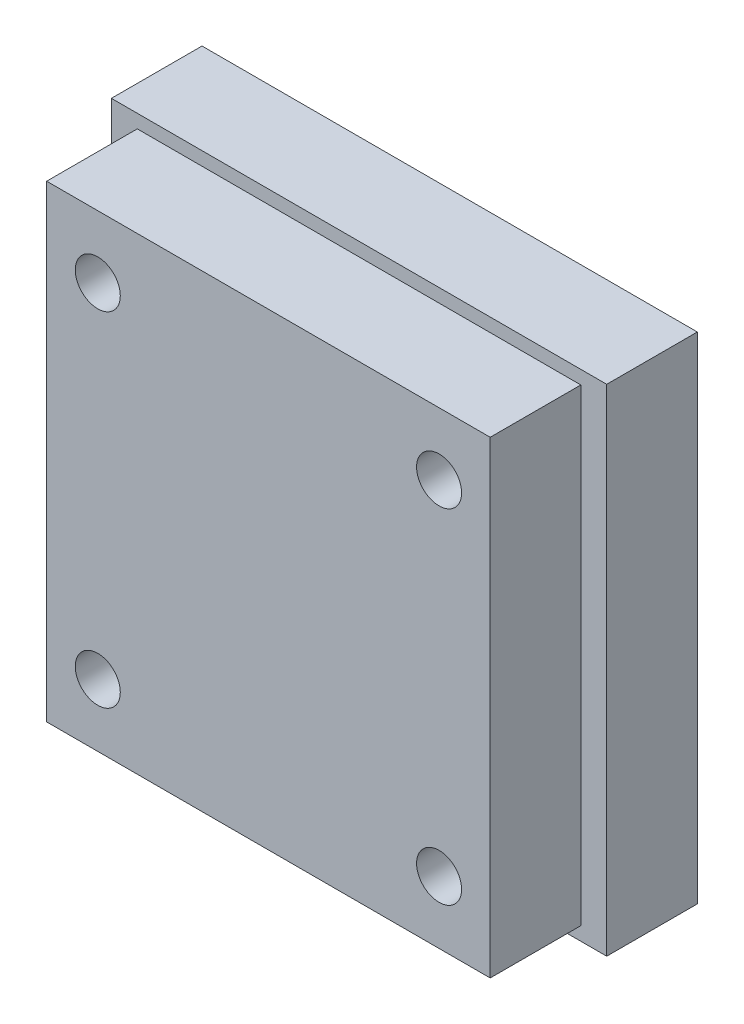
ISO-10303-21;
HEADER;
FILE_DESCRIPTION(('STEP AP214'),'2;1');
FILE_NAME('part.step','',(''),(''),'','','');
FILE_SCHEMA(('AUTOMOTIVE_DESIGN { 1 0 10303 214 1 1 1 1 }'));
ENDSEC;
DATA;
#1=APPLICATION_CONTEXT('core data for automotive mechanical design processes');
#2=APPLICATION_PROTOCOL_DEFINITION('international standard','automotive_design',2000,#1);
#3=PRODUCT_CONTEXT('',#1,'mechanical');
#4=PRODUCT('Part','Part','',(#3));
#5=PRODUCT_RELATED_PRODUCT_CATEGORY('part','',(#4));
#6=PRODUCT_DEFINITION_FORMATION('','',#4);
#7=PRODUCT_DEFINITION_CONTEXT('part definition',#1,'design');
#8=PRODUCT_DEFINITION('design','',#6,#7);
#9=PRODUCT_DEFINITION_SHAPE('','',#8);
#10=(LENGTH_UNIT() NAMED_UNIT(*) SI_UNIT(.MILLI.,.METRE.));
#11=(NAMED_UNIT(*) PLANE_ANGLE_UNIT() SI_UNIT($,.RADIAN.));
#12=(NAMED_UNIT(*) SI_UNIT($,.STERADIAN.) SOLID_ANGLE_UNIT());
#13=UNCERTAINTY_MEASURE_WITH_UNIT(LENGTH_MEASURE(1.E-05),#10,'distance_accuracy_value','');
#14=(GEOMETRIC_REPRESENTATION_CONTEXT(3) GLOBAL_UNCERTAINTY_ASSIGNED_CONTEXT((#13)) GLOBAL_UNIT_ASSIGNED_CONTEXT((#10,
#11,#12)) REPRESENTATION_CONTEXT('',''));
#15=CARTESIAN_POINT('',(0.,0.,0.));
#16=DIRECTION('',(0.,0.,1.));
#17=DIRECTION('',(1.,0.,0.));
#18=AXIS2_PLACEMENT_3D('',#15,#16,#17);
#19=CARTESIAN_POINT('',(0.,0.,8.05));
#20=DIRECTION('',(0.,0.,-1.));
#21=DIRECTION('',(-1.,0.,0.));
#22=AXIS2_PLACEMENT_3D('',#19,#20,#21);
#23=PLANE('',#22);
#24=DIRECTION('',(0.,1.,0.));
#25=VECTOR('',#24,1.);
#26=CARTESIAN_POINT('',(22.,-22.,8.05));
#27=LINE('',#26,#25);
#28=CARTESIAN_POINT('',(22.,-22.,8.05));
#29=VERTEX_POINT('',#28);
#30=CARTESIAN_POINT('',(22.,22.,8.05));
#31=VERTEX_POINT('',#30);
#32=EDGE_CURVE('E141',#29,#31,#27,.T.);
#33=ORIENTED_EDGE('',*,*,#32,.T.);
#34=DIRECTION('',(-1.,0.,0.));
#35=VECTOR('',#34,1.);
#36=CARTESIAN_POINT('',(-22.,22.,8.05));
#37=LINE('',#36,#35);
#38=CARTESIAN_POINT('',(-22.,22.,8.05));
#39=VERTEX_POINT('',#38);
#40=EDGE_CURVE('E144',#31,#39,#37,.T.);
#41=ORIENTED_EDGE('',*,*,#40,.T.);
#42=DIRECTION('',(0.,-1.,0.));
#43=VECTOR('',#42,1.);
#44=CARTESIAN_POINT('',(-22.,-22.,8.05));
#45=LINE('',#44,#43);
#46=CARTESIAN_POINT('',(-22.,-22.,8.05));
#47=VERTEX_POINT('',#46);
#48=EDGE_CURVE('E147',#39,#47,#45,.T.);
#49=ORIENTED_EDGE('',*,*,#48,.T.);
#50=DIRECTION('',(1.,0.,0.));
#51=VECTOR('',#50,1.);
#52=CARTESIAN_POINT('',(-22.,-22.,8.05));
#53=LINE('',#52,#51);
#54=EDGE_CURVE('E149',#47,#29,#53,.T.);
#55=ORIENTED_EDGE('',*,*,#54,.T.);
#56=EDGE_LOOP('',(#33,#41,#49,#55));
#57=FACE_BOUND('',#56,.T.);
#58=DIRECTION('',(0.,1.,0.));
#59=VECTOR('',#58,1.);
#60=CARTESIAN_POINT('',(19.7,-20.8,8.05));
#61=LINE('',#60,#59);
#62=CARTESIAN_POINT('',(19.7,-20.8,8.05));
#63=VERTEX_POINT('',#62);
#64=CARTESIAN_POINT('',(19.7,20.8,8.05));
#65=VERTEX_POINT('',#64);
#66=EDGE_CURVE('E62',#63,#65,#61,.T.);
#67=ORIENTED_EDGE('',*,*,#66,.F.);
#68=DIRECTION('',(1.,0.,0.));
#69=VECTOR('',#68,1.);
#70=CARTESIAN_POINT('',(-19.7,-20.8,8.05));
#71=LINE('',#70,#69);
#72=CARTESIAN_POINT('',(-19.7,-20.8,8.05));
#73=VERTEX_POINT('',#72);
#74=EDGE_CURVE('E66',#73,#63,#71,.T.);
#75=ORIENTED_EDGE('',*,*,#74,.F.);
#76=DIRECTION('',(0.,-1.,0.));
#77=VECTOR('',#76,1.);
#78=CARTESIAN_POINT('',(-19.7,-20.8,8.05));
#79=LINE('',#78,#77);
#80=CARTESIAN_POINT('',(-19.7,20.8,8.05));
#81=VERTEX_POINT('',#80);
#82=EDGE_CURVE('E403',#81,#73,#79,.T.);
#83=ORIENTED_EDGE('',*,*,#82,.F.);
#84=DIRECTION('',(-1.,0.,0.));
#85=VECTOR('',#84,1.);
#86=CARTESIAN_POINT('',(-19.7,20.8,8.05));
#87=LINE('',#86,#85);
#88=EDGE_CURVE('E401',#65,#81,#87,.T.);
#89=ORIENTED_EDGE('',*,*,#88,.F.);
#90=EDGE_LOOP('',(#67,#75,#83,#89));
#91=FACE_BOUND('',#90,.T.);
#92=ADVANCED_FACE('F47',(#57,#91),#23,.F.);
#93=CARTESIAN_POINT('',(22.,-22.,8.05));
#94=DIRECTION('',(-1.,0.,0.));
#95=DIRECTION('',(0.,0.,1.));
#96=AXIS2_PLACEMENT_3D('',#93,#94,#95);
#97=PLANE('',#96);
#98=DIRECTION('',(0.,1.,0.));
#99=VECTOR('',#98,1.);
#100=CARTESIAN_POINT('',(22.,-22.,0.));
#101=LINE('',#100,#99);
#102=CARTESIAN_POINT('',(22.,-22.,0.));
#103=VERTEX_POINT('',#102);
#104=CARTESIAN_POINT('',(22.,22.,0.));
#105=VERTEX_POINT('',#104);
#106=EDGE_CURVE('E132',#103,#105,#101,.T.);
#107=ORIENTED_EDGE('',*,*,#106,.T.);
#108=DIRECTION('',(0.,0.,-1.));
#109=VECTOR('',#108,1.);
#110=CARTESIAN_POINT('',(22.,22.,8.05));
#111=LINE('',#110,#109);
#112=EDGE_CURVE('E11',#31,#105,#111,.T.);
#113=ORIENTED_EDGE('',*,*,#112,.F.);
#114=ORIENTED_EDGE('',*,*,#32,.F.);
#115=DIRECTION('',(0.,0.,-1.));
#116=VECTOR('',#115,1.);
#117=CARTESIAN_POINT('',(22.,-22.,8.05));
#118=LINE('',#117,#116);
#119=EDGE_CURVE('E150',#29,#103,#118,.T.);
#120=ORIENTED_EDGE('',*,*,#119,.T.);
#121=EDGE_LOOP('',(#107,#113,#114,#120));
#122=FACE_BOUND('',#121,.T.);
#123=ADVANCED_FACE('F49',(#122),#97,.F.);
#124=CARTESIAN_POINT('',(-22.,22.,8.05));
#125=DIRECTION('',(0.,-1.,0.));
#126=DIRECTION('',(0.,0.,-1.));
#127=AXIS2_PLACEMENT_3D('',#124,#125,#126);
#128=PLANE('',#127);
#129=DIRECTION('',(-1.,0.,0.));
#130=VECTOR('',#129,1.);
#131=CARTESIAN_POINT('',(-22.,22.,0.));
#132=LINE('',#131,#130);
#133=CARTESIAN_POINT('',(-22.,22.,0.));
#134=VERTEX_POINT('',#133);
#135=EDGE_CURVE('E135',#105,#134,#132,.T.);
#136=ORIENTED_EDGE('',*,*,#135,.T.);
#137=DIRECTION('',(0.,0.,-1.));
#138=VECTOR('',#137,1.);
#139=CARTESIAN_POINT('',(-22.,22.,8.05));
#140=LINE('',#139,#138);
#141=EDGE_CURVE('E55',#39,#134,#140,.T.);
#142=ORIENTED_EDGE('',*,*,#141,.F.);
#143=ORIENTED_EDGE('',*,*,#40,.F.);
#144=ORIENTED_EDGE('',*,*,#112,.T.);
#145=EDGE_LOOP('',(#136,#142,#143,#144));
#146=FACE_BOUND('',#145,.T.);
#147=ADVANCED_FACE('F180',(#146),#128,.F.);
#148=CARTESIAN_POINT('',(-22.,-22.,8.05));
#149=DIRECTION('',(1.,0.,0.));
#150=DIRECTION('',(0.,0.,-1.));
#151=AXIS2_PLACEMENT_3D('',#148,#149,#150);
#152=PLANE('',#151);
#153=DIRECTION('',(0.,-1.,0.));
#154=VECTOR('',#153,1.);
#155=CARTESIAN_POINT('',(-22.,-22.,0.));
#156=LINE('',#155,#154);
#157=CARTESIAN_POINT('',(-22.,-22.,0.));
#158=VERTEX_POINT('',#157);
#159=EDGE_CURVE('E153',#134,#158,#156,.T.);
#160=ORIENTED_EDGE('',*,*,#159,.T.);
#161=DIRECTION('',(0.,0.,-1.));
#162=VECTOR('',#161,1.);
#163=CARTESIAN_POINT('',(-22.,-22.,8.05));
#164=LINE('',#163,#162);
#165=EDGE_CURVE('E158',#47,#158,#164,.T.);
#166=ORIENTED_EDGE('',*,*,#165,.F.);
#167=ORIENTED_EDGE('',*,*,#48,.F.);
#168=ORIENTED_EDGE('',*,*,#141,.T.);
#169=EDGE_LOOP('',(#160,#166,#167,#168));
#170=FACE_BOUND('',#169,.T.);
#171=ADVANCED_FACE('F165',(#170),#152,.F.);
#172=CARTESIAN_POINT('',(-22.,-22.,8.05));
#173=DIRECTION('',(0.,1.,0.));
#174=DIRECTION('',(-1.,0.,0.));
#175=AXIS2_PLACEMENT_3D('',#172,#173,#174);
#176=PLANE('',#175);
#177=DIRECTION('',(1.,0.,0.));
#178=VECTOR('',#177,1.);
#179=CARTESIAN_POINT('',(-22.,-22.,0.));
#180=LINE('',#179,#178);
#181=EDGE_CURVE('E145',#158,#103,#180,.T.);
#182=ORIENTED_EDGE('',*,*,#181,.T.);
#183=ORIENTED_EDGE('',*,*,#119,.F.);
#184=ORIENTED_EDGE('',*,*,#54,.F.);
#185=ORIENTED_EDGE('',*,*,#165,.T.);
#186=EDGE_LOOP('',(#182,#183,#184,#185));
#187=FACE_BOUND('',#186,.T.);
#188=ADVANCED_FACE('F174',(#187),#176,.F.);
#189=CARTESIAN_POINT('',(0.,0.,0.));
#190=DIRECTION('',(0.,0.,-1.));
#191=DIRECTION('',(-1.,0.,0.));
#192=AXIS2_PLACEMENT_3D('',#189,#190,#191);
#193=PLANE('',#192);
#194=CARTESIAN_POINT('',(-15.16,-15.25,0.));
#195=DIRECTION('',(0.,0.,1.));
#196=DIRECTION('',(1.,0.,0.));
#197=AXIS2_PLACEMENT_3D('',#194,#195,#196);
#198=CIRCLE('',#197,2.);
#199=CARTESIAN_POINT('',(-13.16,-15.25,0.));
#200=VERTEX_POINT('',#199);
#201=EDGE_CURVE('E378',#200,#200,#198,.T.);
#202=ORIENTED_EDGE('',*,*,#201,.T.);
#203=EDGE_LOOP('',(#202));
#204=FACE_BOUND('',#203,.T.);
#205=CARTESIAN_POINT('',(15.16,-15.25,0.));
#206=DIRECTION('',(0.,0.,1.));
#207=DIRECTION('',(1.,0.,0.));
#208=AXIS2_PLACEMENT_3D('',#205,#206,#207);
#209=CIRCLE('',#208,2.);
#210=CARTESIAN_POINT('',(17.16,-15.25,0.));
#211=VERTEX_POINT('',#210);
#212=EDGE_CURVE('E382',#211,#211,#209,.T.);
#213=ORIENTED_EDGE('',*,*,#212,.T.);
#214=EDGE_LOOP('',(#213));
#215=FACE_BOUND('',#214,.T.);
#216=CARTESIAN_POINT('',(15.16,15.25,0.));
#217=DIRECTION('',(0.,0.,1.));
#218=DIRECTION('',(1.,0.,0.));
#219=AXIS2_PLACEMENT_3D('',#216,#217,#218);
#220=CIRCLE('',#219,2.);
#221=CARTESIAN_POINT('',(17.16,15.25,0.));
#222=VERTEX_POINT('',#221);
#223=EDGE_CURVE('E411',#222,#222,#220,.T.);
#224=ORIENTED_EDGE('',*,*,#223,.T.);
#225=EDGE_LOOP('',(#224));
#226=FACE_BOUND('',#225,.T.);
#227=CARTESIAN_POINT('',(-15.16,15.25,0.));
#228=DIRECTION('',(0.,0.,1.));
#229=DIRECTION('',(1.,0.,0.));
#230=AXIS2_PLACEMENT_3D('',#227,#228,#229);
#231=CIRCLE('',#230,2.);
#232=CARTESIAN_POINT('',(-13.16,15.25,0.));
#233=VERTEX_POINT('',#232);
#234=EDGE_CURVE('E390',#233,#233,#231,.T.);
#235=ORIENTED_EDGE('',*,*,#234,.T.);
#236=EDGE_LOOP('',(#235));
#237=FACE_BOUND('',#236,.T.);
#238=ORIENTED_EDGE('',*,*,#106,.F.);
#239=ORIENTED_EDGE('',*,*,#181,.F.);
#240=ORIENTED_EDGE('',*,*,#159,.F.);
#241=ORIENTED_EDGE('',*,*,#135,.F.);
#242=EDGE_LOOP('',(#238,#239,#240,#241));
#243=FACE_BOUND('',#242,.T.);
#244=ADVANCED_FACE('F171',(#204,#215,#226,#237,#243),#193,.T.);
#245=CARTESIAN_POINT('',(19.7,-20.8,16.1));
#246=DIRECTION('',(-1.,0.,0.));
#247=DIRECTION('',(0.,0.,1.));
#248=AXIS2_PLACEMENT_3D('',#245,#246,#247);
#249=PLANE('',#248);
#250=ORIENTED_EDGE('',*,*,#66,.T.);
#251=DIRECTION('',(0.,0.,-1.));
#252=VECTOR('',#251,1.);
#253=CARTESIAN_POINT('',(19.7,20.8,16.1));
#254=LINE('',#253,#252);
#255=CARTESIAN_POINT('',(19.7,20.8,16.1));
#256=VERTEX_POINT('',#255);
#257=EDGE_CURVE('E115',#256,#65,#254,.T.);
#258=ORIENTED_EDGE('',*,*,#257,.F.);
#259=DIRECTION('',(0.,1.,0.));
#260=VECTOR('',#259,1.);
#261=CARTESIAN_POINT('',(19.7,-20.8,16.1));
#262=LINE('',#261,#260);
#263=CARTESIAN_POINT('',(19.7,-20.8,16.1));
#264=VERTEX_POINT('',#263);
#265=EDGE_CURVE('E121',#264,#256,#262,.T.);
#266=ORIENTED_EDGE('',*,*,#265,.F.);
#267=DIRECTION('',(0.,0.,-1.));
#268=VECTOR('',#267,1.);
#269=CARTESIAN_POINT('',(19.7,-20.8,16.1));
#270=LINE('',#269,#268);
#271=EDGE_CURVE('E399',#264,#63,#270,.T.);
#272=ORIENTED_EDGE('',*,*,#271,.T.);
#273=EDGE_LOOP('',(#250,#258,#266,#272));
#274=FACE_BOUND('',#273,.T.);
#275=ADVANCED_FACE('F131',(#274),#249,.F.);
#276=CARTESIAN_POINT('',(-19.7,20.8,16.1));
#277=DIRECTION('',(0.,-1.,0.));
#278=DIRECTION('',(0.,0.,-1.));
#279=AXIS2_PLACEMENT_3D('',#276,#277,#278);
#280=PLANE('',#279);
#281=ORIENTED_EDGE('',*,*,#88,.T.);
#282=DIRECTION('',(0.,0.,-1.));
#283=VECTOR('',#282,1.);
#284=CARTESIAN_POINT('',(-19.7,20.8,16.1));
#285=LINE('',#284,#283);
#286=CARTESIAN_POINT('',(-19.7,20.8,16.1));
#287=VERTEX_POINT('',#286);
#288=EDGE_CURVE('E117',#287,#81,#285,.T.);
#289=ORIENTED_EDGE('',*,*,#288,.F.);
#290=DIRECTION('',(-1.,0.,0.));
#291=VECTOR('',#290,1.);
#292=CARTESIAN_POINT('',(-19.7,20.8,16.1));
#293=LINE('',#292,#291);
#294=EDGE_CURVE('E110',#256,#287,#293,.T.);
#295=ORIENTED_EDGE('',*,*,#294,.F.);
#296=ORIENTED_EDGE('',*,*,#257,.T.);
#297=EDGE_LOOP('',(#281,#289,#295,#296));
#298=FACE_BOUND('',#297,.T.);
#299=ADVANCED_FACE('F113',(#298),#280,.F.);
#300=CARTESIAN_POINT('',(-19.7,-20.8,16.1));
#301=DIRECTION('',(1.,0.,0.));
#302=DIRECTION('',(0.,0.,-1.));
#303=AXIS2_PLACEMENT_3D('',#300,#301,#302);
#304=PLANE('',#303);
#305=ORIENTED_EDGE('',*,*,#82,.T.);
#306=DIRECTION('',(0.,0.,-1.));
#307=VECTOR('',#306,1.);
#308=CARTESIAN_POINT('',(-19.7,-20.8,16.1));
#309=LINE('',#308,#307);
#310=CARTESIAN_POINT('',(-19.7,-20.8,16.1));
#311=VERTEX_POINT('',#310);
#312=EDGE_CURVE('E137',#311,#73,#309,.T.);
#313=ORIENTED_EDGE('',*,*,#312,.F.);
#314=DIRECTION('',(0.,-1.,0.));
#315=VECTOR('',#314,1.);
#316=CARTESIAN_POINT('',(-19.7,-20.8,16.1));
#317=LINE('',#316,#315);
#318=EDGE_CURVE('E120',#287,#311,#317,.T.);
#319=ORIENTED_EDGE('',*,*,#318,.F.);
#320=ORIENTED_EDGE('',*,*,#288,.T.);
#321=EDGE_LOOP('',(#305,#313,#319,#320));
#322=FACE_BOUND('',#321,.T.);
#323=ADVANCED_FACE('F217',(#322),#304,.F.);
#324=CARTESIAN_POINT('',(-19.7,-20.8,16.1));
#325=DIRECTION('',(0.,1.,0.));
#326=DIRECTION('',(0.,0.,1.));
#327=AXIS2_PLACEMENT_3D('',#324,#325,#326);
#328=PLANE('',#327);
#329=ORIENTED_EDGE('',*,*,#74,.T.);
#330=ORIENTED_EDGE('',*,*,#271,.F.);
#331=DIRECTION('',(1.,0.,0.));
#332=VECTOR('',#331,1.);
#333=CARTESIAN_POINT('',(-19.7,-20.8,16.1));
#334=LINE('',#333,#332);
#335=EDGE_CURVE('E126',#311,#264,#334,.T.);
#336=ORIENTED_EDGE('',*,*,#335,.F.);
#337=ORIENTED_EDGE('',*,*,#312,.T.);
#338=EDGE_LOOP('',(#329,#330,#336,#337));
#339=FACE_BOUND('',#338,.T.);
#340=ADVANCED_FACE('F223',(#339),#328,.F.);
#341=CARTESIAN_POINT('',(0.,0.,16.1));
#342=DIRECTION('',(0.,0.,-1.));
#343=DIRECTION('',(-1.,0.,0.));
#344=AXIS2_PLACEMENT_3D('',#341,#342,#343);
#345=PLANE('',#344);
#346=CARTESIAN_POINT('',(-15.16,-15.25,16.1));
#347=DIRECTION('',(0.,0.,1.));
#348=DIRECTION('',(1.,0.,0.));
#349=AXIS2_PLACEMENT_3D('',#346,#347,#348);
#350=CIRCLE('',#349,2.);
#351=CARTESIAN_POINT('',(-13.16,-15.25,16.1));
#352=VERTEX_POINT('',#351);
#353=EDGE_CURVE('E381',#352,#352,#350,.T.);
#354=ORIENTED_EDGE('',*,*,#353,.F.);
#355=EDGE_LOOP('',(#354));
#356=FACE_BOUND('',#355,.T.);
#357=CARTESIAN_POINT('',(15.16,-15.25,16.1));
#358=DIRECTION('',(0.,0.,1.));
#359=DIRECTION('',(1.,0.,0.));
#360=AXIS2_PLACEMENT_3D('',#357,#358,#359);
#361=CIRCLE('',#360,2.);
#362=CARTESIAN_POINT('',(17.16,-15.25,16.1));
#363=VERTEX_POINT('',#362);
#364=EDGE_CURVE('E385',#363,#363,#361,.T.);
#365=ORIENTED_EDGE('',*,*,#364,.F.);
#366=EDGE_LOOP('',(#365));
#367=FACE_BOUND('',#366,.T.);
#368=CARTESIAN_POINT('',(15.16,15.25,16.1));
#369=DIRECTION('',(0.,0.,1.));
#370=DIRECTION('',(1.,0.,0.));
#371=AXIS2_PLACEMENT_3D('',#368,#369,#370);
#372=CIRCLE('',#371,2.);
#373=CARTESIAN_POINT('',(17.16,15.25,16.1));
#374=VERTEX_POINT('',#373);
#375=EDGE_CURVE('E395',#374,#374,#372,.T.);
#376=ORIENTED_EDGE('',*,*,#375,.F.);
#377=EDGE_LOOP('',(#376));
#378=FACE_BOUND('',#377,.T.);
#379=CARTESIAN_POINT('',(-15.16,15.25,16.1));
#380=DIRECTION('',(0.,0.,1.));
#381=DIRECTION('',(1.,0.,0.));
#382=AXIS2_PLACEMENT_3D('',#379,#380,#381);
#383=CIRCLE('',#382,2.);
#384=CARTESIAN_POINT('',(-13.16,15.25,16.1));
#385=VERTEX_POINT('',#384);
#386=EDGE_CURVE('E393',#385,#385,#383,.T.);
#387=ORIENTED_EDGE('',*,*,#386,.F.);
#388=EDGE_LOOP('',(#387));
#389=FACE_BOUND('',#388,.T.);
#390=ORIENTED_EDGE('',*,*,#265,.T.);
#391=ORIENTED_EDGE('',*,*,#294,.T.);
#392=ORIENTED_EDGE('',*,*,#318,.T.);
#393=ORIENTED_EDGE('',*,*,#335,.T.);
#394=EDGE_LOOP('',(#390,#391,#392,#393));
#395=FACE_BOUND('',#394,.T.);
#396=ADVANCED_FACE('F124',(#356,#367,#378,#389,#395),#345,.F.);
#397=CARTESIAN_POINT('',(-15.16,15.25,0.));
#398=DIRECTION('',(0.,0.,1.));
#399=DIRECTION('',(1.,0.,0.));
#400=AXIS2_PLACEMENT_3D('',#397,#398,#399);
#401=CYLINDRICAL_SURFACE('',#400,2.);
#402=ORIENTED_EDGE('',*,*,#234,.F.);
#403=EDGE_LOOP('',(#402));
#404=FACE_BOUND('',#403,.T.);
#405=ORIENTED_EDGE('',*,*,#386,.T.);
#406=EDGE_LOOP('',(#405));
#407=FACE_BOUND('',#406,.T.);
#408=ADVANCED_FACE('F238',(#404,#407),#401,.F.);
#409=CARTESIAN_POINT('',(15.16,15.25,0.));
#410=DIRECTION('',(0.,0.,1.));
#411=DIRECTION('',(1.,0.,0.));
#412=AXIS2_PLACEMENT_3D('',#409,#410,#411);
#413=CYLINDRICAL_SURFACE('',#412,2.);
#414=ORIENTED_EDGE('',*,*,#223,.F.);
#415=EDGE_LOOP('',(#414));
#416=FACE_BOUND('',#415,.T.);
#417=ORIENTED_EDGE('',*,*,#375,.T.);
#418=EDGE_LOOP('',(#417));
#419=FACE_BOUND('',#418,.T.);
#420=ADVANCED_FACE('F246',(#416,#419),#413,.F.);
#421=CARTESIAN_POINT('',(15.16,-15.25,0.));
#422=DIRECTION('',(0.,0.,1.));
#423=DIRECTION('',(1.,0.,0.));
#424=AXIS2_PLACEMENT_3D('',#421,#422,#423);
#425=CYLINDRICAL_SURFACE('',#424,2.);
#426=ORIENTED_EDGE('',*,*,#212,.F.);
#427=EDGE_LOOP('',(#426));
#428=FACE_BOUND('',#427,.T.);
#429=ORIENTED_EDGE('',*,*,#364,.T.);
#430=EDGE_LOOP('',(#429));
#431=FACE_BOUND('',#430,.T.);
#432=ADVANCED_FACE('F254',(#428,#431),#425,.F.);
#433=CARTESIAN_POINT('',(-15.16,-15.25,0.));
#434=DIRECTION('',(0.,0.,1.));
#435=DIRECTION('',(1.,0.,0.));
#436=AXIS2_PLACEMENT_3D('',#433,#434,#435);
#437=CYLINDRICAL_SURFACE('',#436,2.);
#438=ORIENTED_EDGE('',*,*,#201,.F.);
#439=EDGE_LOOP('',(#438));
#440=FACE_BOUND('',#439,.T.);
#441=ORIENTED_EDGE('',*,*,#353,.T.);
#442=EDGE_LOOP('',(#441));
#443=FACE_BOUND('',#442,.T.);
#444=ADVANCED_FACE('F262',(#440,#443),#437,.F.);
#445=CLOSED_SHELL('',(#92,#123,#147,#171,#188,#244,#275,#299,#323,#340,#396,#408,#420,#432,#444));
#446=MANIFOLD_SOLID_BREP('B2',#445);
#447=ADVANCED_BREP_SHAPE_REPRESENTATION('',(#18,#446),#14);
#448=SHAPE_DEFINITION_REPRESENTATION(#9,#447);
ENDSEC;
END-ISO-10303-21;
